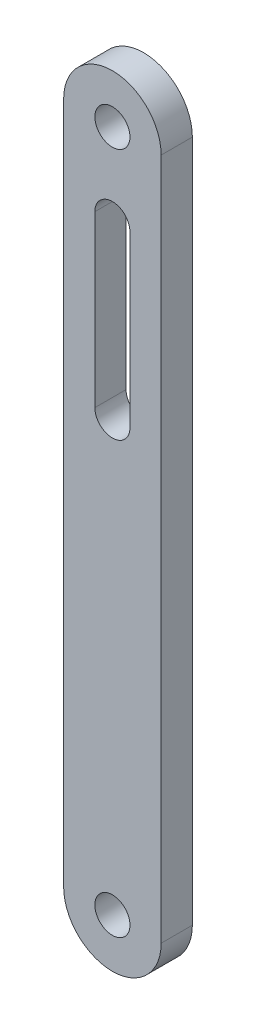
ISO-10303-21;
HEADER;
FILE_DESCRIPTION(('STEP AP214'),'2;1');
FILE_NAME('part.step','',(''),(''),'','','');
FILE_SCHEMA(('AUTOMOTIVE_DESIGN { 1 0 10303 214 1 1 1 1 }'));
ENDSEC;
DATA;
#1=APPLICATION_CONTEXT('core data for automotive mechanical design processes');
#2=APPLICATION_PROTOCOL_DEFINITION('international standard','automotive_design',2000,#1);
#3=PRODUCT_CONTEXT('',#1,'mechanical');
#4=PRODUCT('Part','Part','',(#3));
#5=PRODUCT_RELATED_PRODUCT_CATEGORY('part','',(#4));
#6=PRODUCT_DEFINITION_FORMATION('','',#4);
#7=PRODUCT_DEFINITION_CONTEXT('part definition',#1,'design');
#8=PRODUCT_DEFINITION('design','',#6,#7);
#9=PRODUCT_DEFINITION_SHAPE('','',#8);
#10=(LENGTH_UNIT() NAMED_UNIT(*) SI_UNIT(.MILLI.,.METRE.));
#11=(NAMED_UNIT(*) PLANE_ANGLE_UNIT() SI_UNIT($,.RADIAN.));
#12=(NAMED_UNIT(*) SI_UNIT($,.STERADIAN.) SOLID_ANGLE_UNIT());
#13=UNCERTAINTY_MEASURE_WITH_UNIT(LENGTH_MEASURE(1.E-05),#10,'distance_accuracy_value','');
#14=(GEOMETRIC_REPRESENTATION_CONTEXT(3) GLOBAL_UNCERTAINTY_ASSIGNED_CONTEXT((#13)) GLOBAL_UNIT_ASSIGNED_CONTEXT((#10,
#11,#12)) REPRESENTATION_CONTEXT('',''));
#15=CARTESIAN_POINT('',(0.,0.,0.));
#16=DIRECTION('',(0.,0.,1.));
#17=DIRECTION('',(1.,0.,0.));
#18=AXIS2_PLACEMENT_3D('',#15,#16,#17);
#19=CARTESIAN_POINT('',(0.,-35.,3.2));
#20=DIRECTION('',(0.,0.,1.));
#21=DIRECTION('',(1.,0.,0.));
#22=AXIS2_PLACEMENT_3D('',#19,#20,#21);
#23=PLANE('',#22);
#24=CARTESIAN_POINT('',(0.,35.,3.2));
#25=DIRECTION('',(0.,0.,1.));
#26=DIRECTION('',(1.,0.,0.));
#27=AXIS2_PLACEMENT_3D('',#24,#25,#26);
#28=CIRCLE('',#27,1.8);
#29=CARTESIAN_POINT('',(1.8,35.,3.2));
#30=VERTEX_POINT('',#29);
#31=EDGE_CURVE('E143',#30,#30,#28,.T.);
#32=ORIENTED_EDGE('',*,*,#31,.F.);
#33=EDGE_LOOP('',(#32));
#34=FACE_BOUND('',#33,.T.);
#35=CARTESIAN_POINT('',(0.,-35.,3.2));
#36=DIRECTION('',(0.,0.,1.));
#37=DIRECTION('',(1.,0.,0.));
#38=AXIS2_PLACEMENT_3D('',#35,#36,#37);
#39=CIRCLE('',#38,5.);
#40=CARTESIAN_POINT('',(-5.,-35.,3.2));
#41=VERTEX_POINT('',#40);
#42=CARTESIAN_POINT('',(5.,-35.,3.2));
#43=VERTEX_POINT('',#42);
#44=EDGE_CURVE('E149',#41,#43,#39,.T.);
#45=ORIENTED_EDGE('',*,*,#44,.T.);
#46=DIRECTION('',(0.,1.,0.));
#47=VECTOR('',#46,1.);
#48=CARTESIAN_POINT('',(5.,-35.,3.2));
#49=LINE('',#48,#47);
#50=CARTESIAN_POINT('',(5.,35.,3.2));
#51=VERTEX_POINT('',#50);
#52=EDGE_CURVE('E152',#43,#51,#49,.T.);
#53=ORIENTED_EDGE('',*,*,#52,.T.);
#54=CARTESIAN_POINT('',(0.,35.,3.2));
#55=DIRECTION('',(0.,0.,1.));
#56=DIRECTION('',(1.,0.,0.));
#57=AXIS2_PLACEMENT_3D('',#54,#55,#56);
#58=CIRCLE('',#57,5.);
#59=CARTESIAN_POINT('',(-5.00000000000001,35.,3.2));
#60=VERTEX_POINT('',#59);
#61=EDGE_CURVE('E155',#51,#60,#58,.T.);
#62=ORIENTED_EDGE('',*,*,#61,.T.);
#63=DIRECTION('',(0.,-1.,0.));
#64=VECTOR('',#63,1.);
#65=CARTESIAN_POINT('',(-5.,-35.,3.2));
#66=LINE('',#65,#64);
#67=EDGE_CURVE('E157',#60,#41,#66,.T.);
#68=ORIENTED_EDGE('',*,*,#67,.T.);
#69=EDGE_LOOP('',(#45,#53,#62,#68));
#70=FACE_BOUND('',#69,.T.);
#71=CARTESIAN_POINT('',(0.,-35.,3.2));
#72=DIRECTION('',(0.,0.,1.));
#73=DIRECTION('',(1.,0.,0.));
#74=AXIS2_PLACEMENT_3D('',#71,#72,#73);
#75=CIRCLE('',#74,1.8);
#76=CARTESIAN_POINT('',(1.80000000000002,-35.,3.2));
#77=VERTEX_POINT('',#76);
#78=EDGE_CURVE('E137',#77,#77,#75,.T.);
#79=ORIENTED_EDGE('',*,*,#78,.F.);
#80=EDGE_LOOP('',(#79));
#81=FACE_BOUND('',#80,.T.);
#82=DIRECTION('',(0.,-1.,0.));
#83=VECTOR('',#82,1.);
#84=CARTESIAN_POINT('',(-1.8,26.574427131159,3.2));
#85=LINE('',#84,#83);
#86=CARTESIAN_POINT('',(-1.8,26.574427131159,3.2));
#87=VERTEX_POINT('',#86);
#88=CARTESIAN_POINT('',(-1.8,9.17058453839254,3.2));
#89=VERTEX_POINT('',#88);
#90=EDGE_CURVE('E109',#87,#89,#85,.T.);
#91=ORIENTED_EDGE('',*,*,#90,.F.);
#92=CARTESIAN_POINT('',(0.,26.574427131159,3.2));
#93=DIRECTION('',(0.,0.,1.));
#94=DIRECTION('',(1.,0.,0.));
#95=AXIS2_PLACEMENT_3D('',#92,#93,#94);
#96=CIRCLE('',#95,1.8);
#97=CARTESIAN_POINT('',(1.8,26.574427131159,3.2));
#98=VERTEX_POINT('',#97);
#99=EDGE_CURVE('E101',#98,#87,#96,.T.);
#100=ORIENTED_EDGE('',*,*,#99,.F.);
#101=DIRECTION('',(0.,1.,0.));
#102=VECTOR('',#101,1.);
#103=CARTESIAN_POINT('',(1.8,26.574427131159,3.2));
#104=LINE('',#103,#102);
#105=CARTESIAN_POINT('',(1.8,9.17058453839255,3.2));
#106=VERTEX_POINT('',#105);
#107=EDGE_CURVE('E123',#106,#98,#104,.T.);
#108=ORIENTED_EDGE('',*,*,#107,.F.);
#109=CARTESIAN_POINT('',(0.,9.17058453839256,3.2));
#110=DIRECTION('',(0.,0.,1.));
#111=DIRECTION('',(1.,0.,0.));
#112=AXIS2_PLACEMENT_3D('',#109,#110,#111);
#113=CIRCLE('',#112,1.8);
#114=EDGE_CURVE('E121',#89,#106,#113,.T.);
#115=ORIENTED_EDGE('',*,*,#114,.F.);
#116=EDGE_LOOP('',(#91,#100,#108,#115));
#117=FACE_BOUND('',#116,.T.);
#118=ADVANCED_FACE('F36',(#34,#70,#81,#117),#23,.T.);
#119=CARTESIAN_POINT('',(0.,-35.,0.));
#120=DIRECTION('',(0.,0.,1.));
#121=DIRECTION('',(1.,0.,0.));
#122=AXIS2_PLACEMENT_3D('',#119,#120,#121);
#123=PLANE('',#122);
#124=CARTESIAN_POINT('',(0.,-35.,0.));
#125=DIRECTION('',(0.,0.,1.));
#126=DIRECTION('',(1.,0.,0.));
#127=AXIS2_PLACEMENT_3D('',#124,#125,#126);
#128=CIRCLE('',#127,1.8);
#129=CARTESIAN_POINT('',(1.80000000000002,-35.,0.));
#130=VERTEX_POINT('',#129);
#131=EDGE_CURVE('E117',#130,#130,#128,.T.);
#132=ORIENTED_EDGE('',*,*,#131,.T.);
#133=EDGE_LOOP('',(#132));
#134=FACE_BOUND('',#133,.T.);
#135=CARTESIAN_POINT('',(0.,35.,0.));
#136=DIRECTION('',(0.,0.,1.));
#137=DIRECTION('',(1.,0.,0.));
#138=AXIS2_PLACEMENT_3D('',#135,#136,#137);
#139=CIRCLE('',#138,1.8);
#140=CARTESIAN_POINT('',(1.8,35.,0.));
#141=VERTEX_POINT('',#140);
#142=EDGE_CURVE('E140',#141,#141,#139,.T.);
#143=ORIENTED_EDGE('',*,*,#142,.T.);
#144=EDGE_LOOP('',(#143));
#145=FACE_BOUND('',#144,.T.);
#146=CARTESIAN_POINT('',(0.,-35.,0.));
#147=DIRECTION('',(0.,0.,1.));
#148=DIRECTION('',(1.,0.,0.));
#149=AXIS2_PLACEMENT_3D('',#146,#147,#148);
#150=CIRCLE('',#149,5.);
#151=CARTESIAN_POINT('',(-5.,-35.,0.));
#152=VERTEX_POINT('',#151);
#153=CARTESIAN_POINT('',(5.,-35.,0.));
#154=VERTEX_POINT('',#153);
#155=EDGE_CURVE('E146',#152,#154,#150,.T.);
#156=ORIENTED_EDGE('',*,*,#155,.F.);
#157=DIRECTION('',(0.,-1.,0.));
#158=VECTOR('',#157,1.);
#159=CARTESIAN_POINT('',(-5.,-35.,0.));
#160=LINE('',#159,#158);
#161=CARTESIAN_POINT('',(-5.00000000000001,35.,0.));
#162=VERTEX_POINT('',#161);
#163=EDGE_CURVE('E153',#162,#152,#160,.T.);
#164=ORIENTED_EDGE('',*,*,#163,.F.);
#165=CARTESIAN_POINT('',(0.,35.,0.));
#166=DIRECTION('',(0.,0.,1.));
#167=DIRECTION('',(1.,0.,0.));
#168=AXIS2_PLACEMENT_3D('',#165,#166,#167);
#169=CIRCLE('',#168,5.);
#170=CARTESIAN_POINT('',(5.,35.,0.));
#171=VERTEX_POINT('',#170);
#172=EDGE_CURVE('E164',#171,#162,#169,.T.);
#173=ORIENTED_EDGE('',*,*,#172,.F.);
#174=DIRECTION('',(0.,1.,0.));
#175=VECTOR('',#174,1.);
#176=CARTESIAN_POINT('',(5.,-35.,0.));
#177=LINE('',#176,#175);
#178=EDGE_CURVE('E162',#154,#171,#177,.T.);
#179=ORIENTED_EDGE('',*,*,#178,.F.);
#180=EDGE_LOOP('',(#156,#164,#173,#179));
#181=FACE_BOUND('',#180,.T.);
#182=CARTESIAN_POINT('',(0.,26.574427131159,0.));
#183=DIRECTION('',(0.,0.,1.));
#184=DIRECTION('',(1.,0.,0.));
#185=AXIS2_PLACEMENT_3D('',#182,#183,#184);
#186=CIRCLE('',#185,1.8);
#187=CARTESIAN_POINT('',(1.8,26.574427131159,0.));
#188=VERTEX_POINT('',#187);
#189=CARTESIAN_POINT('',(-1.8,26.574427131159,0.));
#190=VERTEX_POINT('',#189);
#191=EDGE_CURVE('E59',#188,#190,#186,.T.);
#192=ORIENTED_EDGE('',*,*,#191,.T.);
#193=DIRECTION('',(0.,-1.,0.));
#194=VECTOR('',#193,1.);
#195=CARTESIAN_POINT('',(-1.8,26.574427131159,0.));
#196=LINE('',#195,#194);
#197=CARTESIAN_POINT('',(-1.8,9.17058453839254,0.));
#198=VERTEX_POINT('',#197);
#199=EDGE_CURVE('E116',#190,#198,#196,.T.);
#200=ORIENTED_EDGE('',*,*,#199,.T.);
#201=CARTESIAN_POINT('',(0.,9.17058453839256,0.));
#202=DIRECTION('',(0.,0.,1.));
#203=DIRECTION('',(1.,0.,0.));
#204=AXIS2_PLACEMENT_3D('',#201,#202,#203);
#205=CIRCLE('',#204,1.8);
#206=CARTESIAN_POINT('',(1.8,9.17058453839254,0.));
#207=VERTEX_POINT('',#206);
#208=EDGE_CURVE('E129',#198,#207,#205,.T.);
#209=ORIENTED_EDGE('',*,*,#208,.T.);
#210=DIRECTION('',(0.,1.,0.));
#211=VECTOR('',#210,1.);
#212=CARTESIAN_POINT('',(1.8,26.574427131159,0.));
#213=LINE('',#212,#211);
#214=EDGE_CURVE('E110',#207,#188,#213,.T.);
#215=ORIENTED_EDGE('',*,*,#214,.T.);
#216=EDGE_LOOP('',(#192,#200,#209,#215));
#217=FACE_BOUND('',#216,.T.);
#218=ADVANCED_FACE('F182',(#134,#145,#181,#217),#123,.F.);
#219=CARTESIAN_POINT('',(0.,-35.,3.2));
#220=DIRECTION('',(0.,0.,-1.));
#221=DIRECTION('',(-1.,0.,0.));
#222=AXIS2_PLACEMENT_3D('',#219,#220,#221);
#223=CYLINDRICAL_SURFACE('',#222,5.);
#224=ORIENTED_EDGE('',*,*,#155,.T.);
#225=DIRECTION('',(0.,0.,-1.));
#226=VECTOR('',#225,1.);
#227=CARTESIAN_POINT('',(5.,-35.,3.2));
#228=LINE('',#227,#226);
#229=EDGE_CURVE('E11',#43,#154,#228,.T.);
#230=ORIENTED_EDGE('',*,*,#229,.F.);
#231=ORIENTED_EDGE('',*,*,#44,.F.);
#232=DIRECTION('',(0.,0.,-1.));
#233=VECTOR('',#232,1.);
#234=CARTESIAN_POINT('',(-5.,-35.,3.2));
#235=LINE('',#234,#233);
#236=EDGE_CURVE('E159',#41,#152,#235,.T.);
#237=ORIENTED_EDGE('',*,*,#236,.T.);
#238=EDGE_LOOP('',(#224,#230,#231,#237));
#239=FACE_BOUND('',#238,.T.);
#240=ADVANCED_FACE('F38',(#239),#223,.T.);
#241=CARTESIAN_POINT('',(5.,-35.,3.2));
#242=DIRECTION('',(-1.,0.,0.));
#243=DIRECTION('',(0.,-1.,0.));
#244=AXIS2_PLACEMENT_3D('',#241,#242,#243);
#245=PLANE('',#244);
#246=ORIENTED_EDGE('',*,*,#178,.T.);
#247=DIRECTION('',(0.,0.,-1.));
#248=VECTOR('',#247,1.);
#249=CARTESIAN_POINT('',(5.,35.,3.2));
#250=LINE('',#249,#248);
#251=EDGE_CURVE('E44',#51,#171,#250,.T.);
#252=ORIENTED_EDGE('',*,*,#251,.F.);
#253=ORIENTED_EDGE('',*,*,#52,.F.);
#254=ORIENTED_EDGE('',*,*,#229,.T.);
#255=EDGE_LOOP('',(#246,#252,#253,#254));
#256=FACE_BOUND('',#255,.T.);
#257=ADVANCED_FACE('F193',(#256),#245,.F.);
#258=CARTESIAN_POINT('',(0.,35.,3.2));
#259=DIRECTION('',(0.,0.,-1.));
#260=DIRECTION('',(-1.,0.,0.));
#261=AXIS2_PLACEMENT_3D('',#258,#259,#260);
#262=CYLINDRICAL_SURFACE('',#261,5.);
#263=ORIENTED_EDGE('',*,*,#172,.T.);
#264=DIRECTION('',(0.,0.,-1.));
#265=VECTOR('',#264,1.);
#266=CARTESIAN_POINT('',(-5.00000000000001,35.,3.2));
#267=LINE('',#266,#265);
#268=EDGE_CURVE('E169',#60,#162,#267,.T.);
#269=ORIENTED_EDGE('',*,*,#268,.F.);
#270=ORIENTED_EDGE('',*,*,#61,.F.);
#271=ORIENTED_EDGE('',*,*,#251,.T.);
#272=EDGE_LOOP('',(#263,#269,#270,#271));
#273=FACE_BOUND('',#272,.T.);
#274=ADVANCED_FACE('F176',(#273),#262,.T.);
#275=CARTESIAN_POINT('',(-5.,-35.,3.2));
#276=DIRECTION('',(1.,0.,0.));
#277=DIRECTION('',(0.,1.,0.));
#278=AXIS2_PLACEMENT_3D('',#275,#276,#277);
#279=PLANE('',#278);
#280=ORIENTED_EDGE('',*,*,#163,.T.);
#281=ORIENTED_EDGE('',*,*,#236,.F.);
#282=ORIENTED_EDGE('',*,*,#67,.F.);
#283=ORIENTED_EDGE('',*,*,#268,.T.);
#284=EDGE_LOOP('',(#280,#281,#282,#283));
#285=FACE_BOUND('',#284,.T.);
#286=ADVANCED_FACE('F186',(#285),#279,.F.);
#287=CARTESIAN_POINT('',(0.,35.,3.2));
#288=DIRECTION('',(0.,0.,-1.));
#289=DIRECTION('',(-1.,0.,0.));
#290=AXIS2_PLACEMENT_3D('',#287,#288,#289);
#291=CYLINDRICAL_SURFACE('',#290,1.8);
#292=ORIENTED_EDGE('',*,*,#31,.T.);
#293=EDGE_LOOP('',(#292));
#294=FACE_BOUND('',#293,.T.);
#295=ORIENTED_EDGE('',*,*,#142,.F.);
#296=EDGE_LOOP('',(#295));
#297=FACE_BOUND('',#296,.T.);
#298=ADVANCED_FACE('F210',(#294,#297),#291,.F.);
#299=CARTESIAN_POINT('',(0.,-35.,3.2));
#300=DIRECTION('',(0.,0.,-1.));
#301=DIRECTION('',(-1.,0.,0.));
#302=AXIS2_PLACEMENT_3D('',#299,#300,#301);
#303=CYLINDRICAL_SURFACE('',#302,1.8);
#304=ORIENTED_EDGE('',*,*,#78,.T.);
#305=EDGE_LOOP('',(#304));
#306=FACE_BOUND('',#305,.T.);
#307=ORIENTED_EDGE('',*,*,#131,.F.);
#308=EDGE_LOOP('',(#307));
#309=FACE_BOUND('',#308,.T.);
#310=ADVANCED_FACE('F217',(#306,#309),#303,.F.);
#311=CARTESIAN_POINT('',(0.,26.574427131159,3.2));
#312=DIRECTION('',(0.,0.,-1.));
#313=DIRECTION('',(-1.,0.,0.));
#314=AXIS2_PLACEMENT_3D('',#311,#312,#313);
#315=CYLINDRICAL_SURFACE('',#314,1.8);
#316=ORIENTED_EDGE('',*,*,#191,.F.);
#317=DIRECTION('',(0.,0.,-1.));
#318=VECTOR('',#317,1.);
#319=CARTESIAN_POINT('',(1.8,26.574427131159,3.2));
#320=LINE('',#319,#318);
#321=EDGE_CURVE('E105',#98,#188,#320,.T.);
#322=ORIENTED_EDGE('',*,*,#321,.F.);
#323=ORIENTED_EDGE('',*,*,#99,.T.);
#324=DIRECTION('',(0.,0.,-1.));
#325=VECTOR('',#324,1.);
#326=CARTESIAN_POINT('',(-1.8,26.574427131159,3.2));
#327=LINE('',#326,#325);
#328=EDGE_CURVE('E104',#87,#190,#327,.T.);
#329=ORIENTED_EDGE('',*,*,#328,.T.);
#330=EDGE_LOOP('',(#316,#322,#323,#329));
#331=FACE_BOUND('',#330,.T.);
#332=ADVANCED_FACE('F103',(#331),#315,.F.);
#333=CARTESIAN_POINT('',(-1.8,26.574427131159,3.2));
#334=DIRECTION('',(1.,0.,0.));
#335=DIRECTION('',(0.,1.,0.));
#336=AXIS2_PLACEMENT_3D('',#333,#334,#335);
#337=PLANE('',#336);
#338=ORIENTED_EDGE('',*,*,#199,.F.);
#339=ORIENTED_EDGE('',*,*,#328,.F.);
#340=ORIENTED_EDGE('',*,*,#90,.T.);
#341=DIRECTION('',(0.,0.,-1.));
#342=VECTOR('',#341,1.);
#343=CARTESIAN_POINT('',(-1.8,9.17058453839254,3.2));
#344=LINE('',#343,#342);
#345=EDGE_CURVE('E118',#89,#198,#344,.T.);
#346=ORIENTED_EDGE('',*,*,#345,.T.);
#347=EDGE_LOOP('',(#338,#339,#340,#346));
#348=FACE_BOUND('',#347,.T.);
#349=ADVANCED_FACE('F113',(#348),#337,.T.);
#350=CARTESIAN_POINT('',(0.,9.17058453839256,3.2));
#351=DIRECTION('',(0.,0.,-1.));
#352=DIRECTION('',(-1.,0.,0.));
#353=AXIS2_PLACEMENT_3D('',#350,#351,#352);
#354=CYLINDRICAL_SURFACE('',#353,1.8);
#355=ORIENTED_EDGE('',*,*,#208,.F.);
#356=ORIENTED_EDGE('',*,*,#345,.F.);
#357=ORIENTED_EDGE('',*,*,#114,.T.);
#358=DIRECTION('',(0.,0.,-1.));
#359=VECTOR('',#358,1.);
#360=CARTESIAN_POINT('',(1.8,9.17058453839254,3.2));
#361=LINE('',#360,#359);
#362=EDGE_CURVE('E51',#106,#207,#361,.T.);
#363=ORIENTED_EDGE('',*,*,#362,.T.);
#364=EDGE_LOOP('',(#355,#356,#357,#363));
#365=FACE_BOUND('',#364,.T.);
#366=ADVANCED_FACE('F234',(#365),#354,.F.);
#367=CARTESIAN_POINT('',(1.8,26.574427131159,3.2));
#368=DIRECTION('',(-1.,0.,0.));
#369=DIRECTION('',(0.,0.,1.));
#370=AXIS2_PLACEMENT_3D('',#367,#368,#369);
#371=PLANE('',#370);
#372=ORIENTED_EDGE('',*,*,#214,.F.);
#373=ORIENTED_EDGE('',*,*,#362,.F.);
#374=ORIENTED_EDGE('',*,*,#107,.T.);
#375=ORIENTED_EDGE('',*,*,#321,.T.);
#376=EDGE_LOOP('',(#372,#373,#374,#375));
#377=FACE_BOUND('',#376,.T.);
#378=ADVANCED_FACE('F237',(#377),#371,.T.);
#379=CLOSED_SHELL('',(#118,#218,#240,#257,#274,#286,#298,#310,#332,#349,#366,#378));
#380=MANIFOLD_SOLID_BREP('B2',#379);
#381=ADVANCED_BREP_SHAPE_REPRESENTATION('',(#18,#380),#14);
#382=SHAPE_DEFINITION_REPRESENTATION(#9,#381);
ENDSEC;
END-ISO-10303-21;
